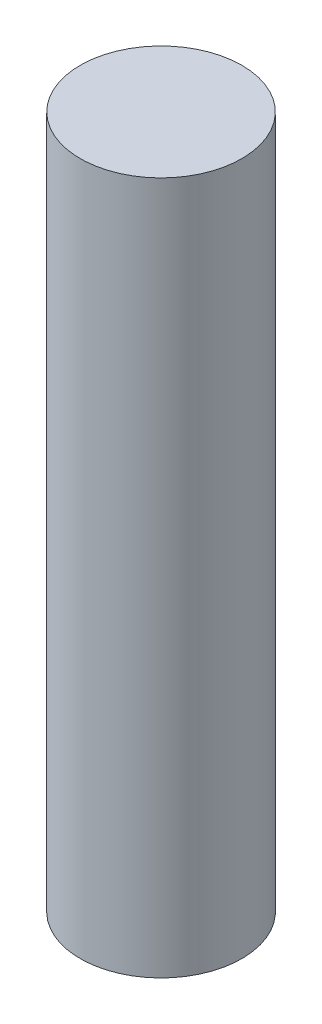
ISO-10303-21;
HEADER;
FILE_DESCRIPTION(('STEP AP214'),'2;1');
FILE_NAME('part.step','',(''),(''),'','','');
FILE_SCHEMA(('AUTOMOTIVE_DESIGN { 1 0 10303 214 1 1 1 1 }'));
ENDSEC;
DATA;
#1=APPLICATION_CONTEXT('core data for automotive mechanical design processes');
#2=APPLICATION_PROTOCOL_DEFINITION('international standard','automotive_design',2000,#1);
#3=PRODUCT_CONTEXT('',#1,'mechanical');
#4=PRODUCT('Part','Part','',(#3));
#5=PRODUCT_RELATED_PRODUCT_CATEGORY('part','',(#4));
#6=PRODUCT_DEFINITION_FORMATION('','',#4);
#7=PRODUCT_DEFINITION_CONTEXT('part definition',#1,'design');
#8=PRODUCT_DEFINITION('design','',#6,#7);
#9=PRODUCT_DEFINITION_SHAPE('','',#8);
#10=(LENGTH_UNIT() NAMED_UNIT(*) SI_UNIT(.MILLI.,.METRE.));
#11=(NAMED_UNIT(*) PLANE_ANGLE_UNIT() SI_UNIT($,.RADIAN.));
#12=(NAMED_UNIT(*) SI_UNIT($,.STERADIAN.) SOLID_ANGLE_UNIT());
#13=UNCERTAINTY_MEASURE_WITH_UNIT(LENGTH_MEASURE(1.E-05),#10,'distance_accuracy_value','');
#14=(GEOMETRIC_REPRESENTATION_CONTEXT(3) GLOBAL_UNCERTAINTY_ASSIGNED_CONTEXT((#13)) GLOBAL_UNIT_ASSIGNED_CONTEXT((#10,
#11,#12)) REPRESENTATION_CONTEXT('',''));
#15=CARTESIAN_POINT('',(0.,0.,0.));
#16=DIRECTION('',(0.,0.,1.));
#17=DIRECTION('',(1.,0.,0.));
#18=AXIS2_PLACEMENT_3D('',#15,#16,#17);
#19=CARTESIAN_POINT('',(0.,19.05,0.));
#20=DIRECTION('',(0.,-1.,0.));
#21=DIRECTION('',(0.,0.,-1.));
#22=AXIS2_PLACEMENT_3D('',#19,#20,#21);
#23=CYLINDRICAL_SURFACE('',#22,2.2225);
#24=CARTESIAN_POINT('',(0.,19.05,0.));
#25=DIRECTION('',(0.,1.,0.));
#26=DIRECTION('',(0.,0.,1.));
#27=AXIS2_PLACEMENT_3D('',#24,#25,#26);
#28=CIRCLE('',#27,2.2225);
#29=CARTESIAN_POINT('',(0.,19.05,-2.2225));
#30=VERTEX_POINT('',#29);
#31=EDGE_CURVE('E10',#30,#30,#28,.T.);
#32=CARTESIAN_POINT('',(0.,0.,0.));
#33=DIRECTION('',(0.,1.,0.));
#34=DIRECTION('',(0.,0.,1.));
#35=AXIS2_PLACEMENT_3D('',#32,#33,#34);
#36=CIRCLE('',#35,2.2225);
#37=CARTESIAN_POINT('',(0.,0.,-2.2225));
#38=VERTEX_POINT('',#37);
#39=EDGE_CURVE('E34',#38,#38,#36,.T.);
#40=CARTESIAN_POINT('',(0.,19.05,-2.2225));
#41=CARTESIAN_POINT('',(0.,18.8515625,-2.2225));
#42=CARTESIAN_POINT('',(0.,18.653125,-2.2225));
#43=CARTESIAN_POINT('',(0.,18.25625,-2.2225));
#44=CARTESIAN_POINT('',(0.,18.0578125,-2.2225));
#45=CARTESIAN_POINT('',(0.,17.6609375,-2.2225));
#46=CARTESIAN_POINT('',(0.,17.4625,-2.2225));
#47=CARTESIAN_POINT('',(0.,17.065625,-2.2225));
#48=CARTESIAN_POINT('',(0.,16.8671875,-2.2225));
#49=CARTESIAN_POINT('',(0.,16.4703125,-2.2225));
#50=CARTESIAN_POINT('',(0.,16.271875,-2.2225));
#51=CARTESIAN_POINT('',(0.,15.875,-2.2225));
#52=CARTESIAN_POINT('',(0.,15.6765625,-2.2225));
#53=CARTESIAN_POINT('',(0.,15.2796875,-2.2225));
#54=CARTESIAN_POINT('',(0.,15.08125,-2.2225));
#55=CARTESIAN_POINT('',(0.,14.684375,-2.2225));
#56=CARTESIAN_POINT('',(0.,14.4859375,-2.2225));
#57=CARTESIAN_POINT('',(0.,14.0890625,-2.2225));
#58=CARTESIAN_POINT('',(0.,13.890625,-2.2225));
#59=CARTESIAN_POINT('',(0.,13.49375,-2.2225));
#60=CARTESIAN_POINT('',(0.,13.2953125,-2.2225));
#61=CARTESIAN_POINT('',(0.,12.8984375,-2.2225));
#62=CARTESIAN_POINT('',(0.,12.7,-2.2225));
#63=CARTESIAN_POINT('',(0.,12.303125,-2.2225));
#64=CARTESIAN_POINT('',(0.,12.1046875,-2.2225));
#65=CARTESIAN_POINT('',(0.,11.7078125,-2.2225));
#66=CARTESIAN_POINT('',(0.,11.509375,-2.2225));
#67=CARTESIAN_POINT('',(0.,11.1125,-2.2225));
#68=CARTESIAN_POINT('',(0.,10.9140625,-2.2225));
#69=CARTESIAN_POINT('',(0.,10.5171875,-2.2225));
#70=CARTESIAN_POINT('',(0.,10.31875,-2.2225));
#71=CARTESIAN_POINT('',(0.,9.921875,-2.2225));
#72=CARTESIAN_POINT('',(0.,9.7234375,-2.2225));
#73=CARTESIAN_POINT('',(0.,9.3265625,-2.2225));
#74=CARTESIAN_POINT('',(0.,9.128125,-2.2225));
#75=CARTESIAN_POINT('',(0.,8.73125,-2.2225));
#76=CARTESIAN_POINT('',(0.,8.5328125,-2.2225));
#77=CARTESIAN_POINT('',(0.,8.1359375,-2.2225));
#78=CARTESIAN_POINT('',(0.,7.9375,-2.2225));
#79=CARTESIAN_POINT('',(0.,7.540625,-2.2225));
#80=CARTESIAN_POINT('',(0.,7.3421875,-2.2225));
#81=CARTESIAN_POINT('',(0.,6.9453125,-2.2225));
#82=CARTESIAN_POINT('',(0.,6.746875,-2.2225));
#83=CARTESIAN_POINT('',(0.,6.35,-2.2225));
#84=CARTESIAN_POINT('',(0.,6.1515625,-2.2225));
#85=CARTESIAN_POINT('',(0.,5.7546875,-2.2225));
#86=CARTESIAN_POINT('',(0.,5.55625,-2.2225));
#87=CARTESIAN_POINT('',(0.,5.159375,-2.2225));
#88=CARTESIAN_POINT('',(0.,4.9609375,-2.2225));
#89=CARTESIAN_POINT('',(0.,4.5640625,-2.2225));
#90=CARTESIAN_POINT('',(0.,4.365625,-2.2225));
#91=CARTESIAN_POINT('',(0.,3.96875,-2.2225));
#92=CARTESIAN_POINT('',(0.,3.7703125,-2.2225));
#93=CARTESIAN_POINT('',(0.,3.3734375,-2.2225));
#94=CARTESIAN_POINT('',(0.,3.175,-2.2225));
#95=CARTESIAN_POINT('',(0.,2.778125,-2.2225));
#96=CARTESIAN_POINT('',(0.,2.5796875,-2.2225));
#97=CARTESIAN_POINT('',(0.,2.1828125,-2.2225));
#98=CARTESIAN_POINT('',(0.,1.984375,-2.2225));
#99=CARTESIAN_POINT('',(0.,1.5875,-2.2225));
#100=CARTESIAN_POINT('',(0.,1.3890625,-2.2225));
#101=CARTESIAN_POINT('',(0.,0.992187500000001,-2.2225));
#102=CARTESIAN_POINT('',(0.,0.793750000000001,-2.2225));
#103=CARTESIAN_POINT('',(0.,0.396875,-2.2225));
#104=CARTESIAN_POINT('',(0.,0.1984375,-2.2225));
#105=CARTESIAN_POINT('',(0.,0.,-2.2225));
#106=B_SPLINE_CURVE_WITH_KNOTS('',3,(#40,#41,#42,#43,#44,#45,#46,#47,#48,#49,#50,#51,#52,#53,
#54,#55,#56,#57,#58,#59,#60,#61,#62,#63,#64,#65,#66,#67,#68,#69,#70,#71,#72,#73,#74,#75,#76,#77,
#78,#79,#80,#81,#82,#83,#84,#85,#86,#87,#88,#89,#90,#91,#92,#93,#94,#95,#96,#97,#98,#99,#100,
#101,#102,#103,#104,#105),.UNSPECIFIED.,.F.,.F.,(4,2,2,2,2,2,2,2,2,2,2,2,2,2,2,2,2,2,2,2,2,2,2,
2,2,2,2,2,2,2,2,2,4),(0.,0.595312499999997,1.190625,1.7859375,2.38125,2.9765625,3.571875,
4.1671875,4.7625,5.3578125,5.953125,6.5484375,7.14375,7.7390625,8.334375,8.9296875,9.525,
10.1203125,10.715625,11.3109375,11.90625,12.5015625,13.096875,13.6921875,14.2875,14.8828125,
15.478125,16.0734375,16.66875,17.2640625,17.859375,18.4546875,19.05),.UNSPECIFIED.);
#107=EDGE_CURVE('BSEAM31',#30,#38,#106,.T.);
#108=ORIENTED_EDGE('',*,*,#31,.F.);
#109=ORIENTED_EDGE('',*,*,#39,.T.);
#110=ORIENTED_EDGE('',*,*,#107,.T.);
#111=ORIENTED_EDGE('',*,*,#107,.F.);
#112=EDGE_LOOP('',(#108,#110,#109,#111));
#113=FACE_BOUND('',#112,.T.);
#114=ADVANCED_FACE('F31',(#113),#23,.T.);
#115=CARTESIAN_POINT('',(0.,19.05,0.));
#116=DIRECTION('',(0.,1.,0.));
#117=DIRECTION('',(0.,0.,1.));
#118=AXIS2_PLACEMENT_3D('',#115,#116,#117);
#119=PLANE('',#118);
#120=ORIENTED_EDGE('',*,*,#31,.T.);
#121=EDGE_LOOP('',(#120));
#122=FACE_BOUND('',#121,.T.);
#123=ADVANCED_FACE('F46',(#122),#119,.T.);
#124=CARTESIAN_POINT('',(0.,0.,0.));
#125=DIRECTION('',(0.,1.,0.));
#126=DIRECTION('',(0.,0.,1.));
#127=AXIS2_PLACEMENT_3D('',#124,#125,#126);
#128=PLANE('',#127);
#129=ORIENTED_EDGE('',*,*,#39,.F.);
#130=EDGE_LOOP('',(#129));
#131=FACE_BOUND('',#130,.T.);
#132=ADVANCED_FACE('F44',(#131),#128,.F.);
#133=CLOSED_SHELL('',(#114,#123,#132));
#134=MANIFOLD_SOLID_BREP('B2',#133);
#135=ADVANCED_BREP_SHAPE_REPRESENTATION('',(#18,#134),#14);
#136=SHAPE_DEFINITION_REPRESENTATION(#9,#135);
ENDSEC;
END-ISO-10303-21;
